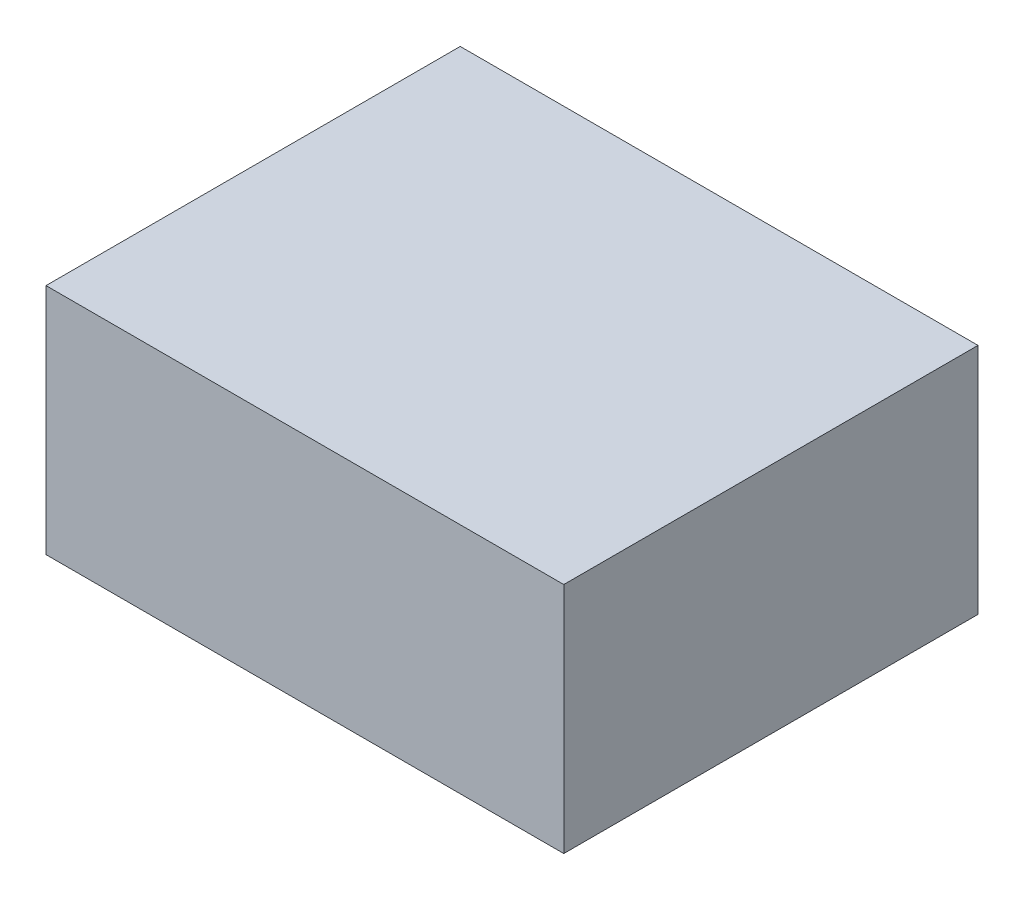
ISO-10303-21;
HEADER;
FILE_DESCRIPTION(('STEP AP214'),'2;1');
FILE_NAME('part.step','',(''),(''),'','','');
FILE_SCHEMA(('AUTOMOTIVE_DESIGN { 1 0 10303 214 1 1 1 1 }'));
ENDSEC;
DATA;
#1=APPLICATION_CONTEXT('core data for automotive mechanical design processes');
#2=APPLICATION_PROTOCOL_DEFINITION('international standard','automotive_design',2000,#1);
#3=PRODUCT_CONTEXT('',#1,'mechanical');
#4=PRODUCT('Part','Part','',(#3));
#5=PRODUCT_RELATED_PRODUCT_CATEGORY('part','',(#4));
#6=PRODUCT_DEFINITION_FORMATION('','',#4);
#7=PRODUCT_DEFINITION_CONTEXT('part definition',#1,'design');
#8=PRODUCT_DEFINITION('design','',#6,#7);
#9=PRODUCT_DEFINITION_SHAPE('','',#8);
#10=(LENGTH_UNIT() NAMED_UNIT(*) SI_UNIT(.MILLI.,.METRE.));
#11=(NAMED_UNIT(*) PLANE_ANGLE_UNIT() SI_UNIT($,.RADIAN.));
#12=(NAMED_UNIT(*) SI_UNIT($,.STERADIAN.) SOLID_ANGLE_UNIT());
#13=UNCERTAINTY_MEASURE_WITH_UNIT(LENGTH_MEASURE(1.E-05),#10,'distance_accuracy_value','');
#14=(GEOMETRIC_REPRESENTATION_CONTEXT(3) GLOBAL_UNCERTAINTY_ASSIGNED_CONTEXT((#13)) GLOBAL_UNIT_ASSIGNED_CONTEXT((#10,
#11,#12)) REPRESENTATION_CONTEXT('',''));
#15=CARTESIAN_POINT('',(0.,0.,0.));
#16=DIRECTION('',(0.,0.,1.));
#17=DIRECTION('',(1.,0.,0.));
#18=AXIS2_PLACEMENT_3D('',#15,#16,#17);
#19=CARTESIAN_POINT('',(0.,45.,0.));
#20=DIRECTION('',(1.,0.,0.));
#21=DIRECTION('',(0.,0.,-1.));
#22=AXIS2_PLACEMENT_3D('',#19,#20,#21);
#23=PLANE('',#22);
#24=DIRECTION('',(0.,0.,1.));
#25=VECTOR('',#24,1.);
#26=CARTESIAN_POINT('',(0.,0.,0.));
#27=LINE('',#26,#25);
#28=CARTESIAN_POINT('',(0.,0.,0.));
#29=VERTEX_POINT('',#28);
#30=CARTESIAN_POINT('',(0.,0.,80.));
#31=VERTEX_POINT('',#30);
#32=EDGE_CURVE('E104',#29,#31,#27,.T.);
#33=ORIENTED_EDGE('',*,*,#32,.T.);
#34=DIRECTION('',(0.,-1.,0.));
#35=VECTOR('',#34,1.);
#36=CARTESIAN_POINT('',(0.,45.,80.));
#37=LINE('',#36,#35);
#38=CARTESIAN_POINT('',(0.,45.,80.));
#39=VERTEX_POINT('',#38);
#40=EDGE_CURVE('E11',#39,#31,#37,.T.);
#41=ORIENTED_EDGE('',*,*,#40,.F.);
#42=DIRECTION('',(0.,0.,1.));
#43=VECTOR('',#42,1.);
#44=CARTESIAN_POINT('',(0.,45.,0.));
#45=LINE('',#44,#43);
#46=CARTESIAN_POINT('',(0.,45.,0.));
#47=VERTEX_POINT('',#46);
#48=EDGE_CURVE('E92',#47,#39,#45,.T.);
#49=ORIENTED_EDGE('',*,*,#48,.F.);
#50=DIRECTION('',(0.,-1.,0.));
#51=VECTOR('',#50,1.);
#52=CARTESIAN_POINT('',(0.,45.,0.));
#53=LINE('',#52,#51);
#54=EDGE_CURVE('E100',#47,#29,#53,.T.);
#55=ORIENTED_EDGE('',*,*,#54,.T.);
#56=EDGE_LOOP('',(#33,#41,#49,#55));
#57=FACE_BOUND('',#56,.T.);
#58=ADVANCED_FACE('F41',(#57),#23,.F.);
#59=CARTESIAN_POINT('',(0.,45.,80.));
#60=DIRECTION('',(0.,0.,-1.));
#61=DIRECTION('',(-1.,0.,0.));
#62=AXIS2_PLACEMENT_3D('',#59,#60,#61);
#63=PLANE('',#62);
#64=DIRECTION('',(1.,0.,0.));
#65=VECTOR('',#64,1.);
#66=CARTESIAN_POINT('',(0.,0.,80.));
#67=LINE('',#66,#65);
#68=CARTESIAN_POINT('',(100.,0.,80.));
#69=VERTEX_POINT('',#68);
#70=EDGE_CURVE('E96',#31,#69,#67,.T.);
#71=ORIENTED_EDGE('',*,*,#70,.T.);
#72=DIRECTION('',(0.,-1.,0.));
#73=VECTOR('',#72,1.);
#74=CARTESIAN_POINT('',(100.,45.,80.));
#75=LINE('',#74,#73);
#76=CARTESIAN_POINT('',(100.,45.,80.));
#77=VERTEX_POINT('',#76);
#78=EDGE_CURVE('E49',#77,#69,#75,.T.);
#79=ORIENTED_EDGE('',*,*,#78,.F.);
#80=DIRECTION('',(1.,0.,0.));
#81=VECTOR('',#80,1.);
#82=CARTESIAN_POINT('',(0.,45.,80.));
#83=LINE('',#82,#81);
#84=EDGE_CURVE('E87',#39,#77,#83,.T.);
#85=ORIENTED_EDGE('',*,*,#84,.F.);
#86=ORIENTED_EDGE('',*,*,#40,.T.);
#87=EDGE_LOOP('',(#71,#79,#85,#86));
#88=FACE_BOUND('',#87,.T.);
#89=ADVANCED_FACE('F95',(#88),#63,.F.);
#90=CARTESIAN_POINT('',(100.,45.,0.));
#91=DIRECTION('',(-1.,0.,0.));
#92=DIRECTION('',(0.,0.,1.));
#93=AXIS2_PLACEMENT_3D('',#90,#91,#92);
#94=PLANE('',#93);
#95=DIRECTION('',(0.,0.,-1.));
#96=VECTOR('',#95,1.);
#97=CARTESIAN_POINT('',(100.,0.,0.));
#98=LINE('',#97,#96);
#99=CARTESIAN_POINT('',(100.,0.,0.));
#100=VERTEX_POINT('',#99);
#101=EDGE_CURVE('E74',#69,#100,#98,.T.);
#102=ORIENTED_EDGE('',*,*,#101,.T.);
#103=DIRECTION('',(0.,-1.,0.));
#104=VECTOR('',#103,1.);
#105=CARTESIAN_POINT('',(100.,45.,0.));
#106=LINE('',#105,#104);
#107=CARTESIAN_POINT('',(100.,45.,0.));
#108=VERTEX_POINT('',#107);
#109=EDGE_CURVE('E97',#108,#100,#106,.T.);
#110=ORIENTED_EDGE('',*,*,#109,.F.);
#111=DIRECTION('',(0.,0.,-1.));
#112=VECTOR('',#111,1.);
#113=CARTESIAN_POINT('',(100.,45.,0.));
#114=LINE('',#113,#112);
#115=EDGE_CURVE('E90',#77,#108,#114,.T.);
#116=ORIENTED_EDGE('',*,*,#115,.F.);
#117=ORIENTED_EDGE('',*,*,#78,.T.);
#118=EDGE_LOOP('',(#102,#110,#116,#117));
#119=FACE_BOUND('',#118,.T.);
#120=ADVANCED_FACE('F98',(#119),#94,.F.);
#121=CARTESIAN_POINT('',(0.,45.,0.));
#122=DIRECTION('',(0.,0.,1.));
#123=DIRECTION('',(1.,0.,0.));
#124=AXIS2_PLACEMENT_3D('',#121,#122,#123);
#125=PLANE('',#124);
#126=DIRECTION('',(-1.,0.,0.));
#127=VECTOR('',#126,1.);
#128=CARTESIAN_POINT('',(0.,0.,0.));
#129=LINE('',#128,#127);
#130=EDGE_CURVE('E80',#100,#29,#129,.T.);
#131=ORIENTED_EDGE('',*,*,#130,.T.);
#132=ORIENTED_EDGE('',*,*,#54,.F.);
#133=DIRECTION('',(-1.,0.,0.));
#134=VECTOR('',#133,1.);
#135=CARTESIAN_POINT('',(0.,45.,0.));
#136=LINE('',#135,#134);
#137=EDGE_CURVE('E57',#108,#47,#136,.T.);
#138=ORIENTED_EDGE('',*,*,#137,.F.);
#139=ORIENTED_EDGE('',*,*,#109,.T.);
#140=EDGE_LOOP('',(#131,#132,#138,#139));
#141=FACE_BOUND('',#140,.T.);
#142=ADVANCED_FACE('F111',(#141),#125,.F.);
#143=CARTESIAN_POINT('',(0.,45.,0.));
#144=DIRECTION('',(0.,1.,0.));
#145=DIRECTION('',(0.,0.,1.));
#146=AXIS2_PLACEMENT_3D('',#143,#144,#145);
#147=PLANE('',#146);
#148=ORIENTED_EDGE('',*,*,#48,.T.);
#149=ORIENTED_EDGE('',*,*,#84,.T.);
#150=ORIENTED_EDGE('',*,*,#115,.T.);
#151=ORIENTED_EDGE('',*,*,#137,.T.);
#152=EDGE_LOOP('',(#148,#149,#150,#151));
#153=FACE_BOUND('',#152,.T.);
#154=ADVANCED_FACE('F88',(#153),#147,.T.);
#155=CARTESIAN_POINT('',(0.,0.,0.));
#156=DIRECTION('',(0.,1.,0.));
#157=DIRECTION('',(0.,0.,1.));
#158=AXIS2_PLACEMENT_3D('',#155,#156,#157);
#159=PLANE('',#158);
#160=ORIENTED_EDGE('',*,*,#32,.F.);
#161=ORIENTED_EDGE('',*,*,#130,.F.);
#162=ORIENTED_EDGE('',*,*,#101,.F.);
#163=ORIENTED_EDGE('',*,*,#70,.F.);
#164=EDGE_LOOP('',(#160,#161,#162,#163));
#165=FACE_BOUND('',#164,.T.);
#166=ADVANCED_FACE('F114',(#165),#159,.F.);
#167=CLOSED_SHELL('',(#58,#89,#120,#142,#154,#166));
#168=MANIFOLD_SOLID_BREP('B2',#167);
#169=ADVANCED_BREP_SHAPE_REPRESENTATION('',(#18,#168),#14);
#170=SHAPE_DEFINITION_REPRESENTATION(#9,#169);
ENDSEC;
END-ISO-10303-21;
